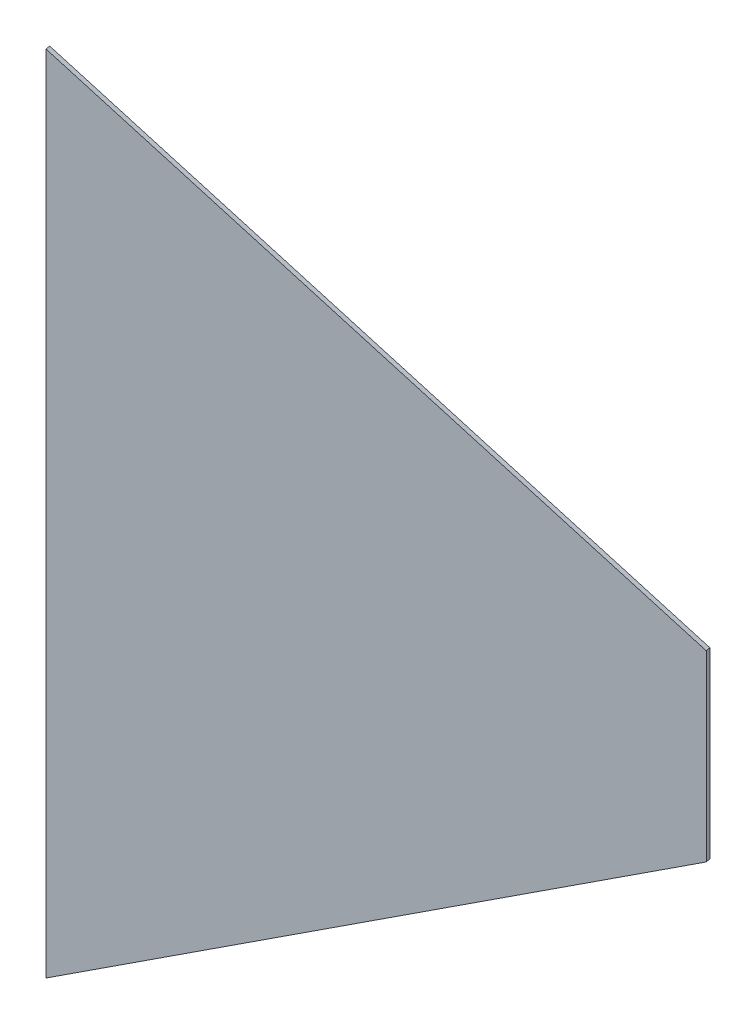
ISO-10303-21;
HEADER;
FILE_DESCRIPTION(('STEP AP214'),'2;1');
FILE_NAME('part.step','',(''),(''),'','','');
FILE_SCHEMA(('AUTOMOTIVE_DESIGN { 1 0 10303 214 1 1 1 1 }'));
ENDSEC;
DATA;
#1=APPLICATION_CONTEXT('core data for automotive mechanical design processes');
#2=APPLICATION_PROTOCOL_DEFINITION('international standard','automotive_design',2000,#1);
#3=PRODUCT_CONTEXT('',#1,'mechanical');
#4=PRODUCT('Part','Part','',(#3));
#5=PRODUCT_RELATED_PRODUCT_CATEGORY('part','',(#4));
#6=PRODUCT_DEFINITION_FORMATION('','',#4);
#7=PRODUCT_DEFINITION_CONTEXT('part definition',#1,'design');
#8=PRODUCT_DEFINITION('design','',#6,#7);
#9=PRODUCT_DEFINITION_SHAPE('','',#8);
#10=(LENGTH_UNIT() NAMED_UNIT(*) SI_UNIT(.MILLI.,.METRE.));
#11=(NAMED_UNIT(*) PLANE_ANGLE_UNIT() SI_UNIT($,.RADIAN.));
#12=(NAMED_UNIT(*) SI_UNIT($,.STERADIAN.) SOLID_ANGLE_UNIT());
#13=UNCERTAINTY_MEASURE_WITH_UNIT(LENGTH_MEASURE(1.E-05),#10,'distance_accuracy_value','');
#14=(GEOMETRIC_REPRESENTATION_CONTEXT(3) GLOBAL_UNCERTAINTY_ASSIGNED_CONTEXT((#13)) GLOBAL_UNIT_ASSIGNED_CONTEXT((#10,
#11,#12)) REPRESENTATION_CONTEXT('',''));
#15=CARTESIAN_POINT('',(0.,0.,0.));
#16=DIRECTION('',(0.,0.,1.));
#17=DIRECTION('',(1.,0.,0.));
#18=AXIS2_PLACEMENT_3D('',#15,#16,#17);
#19=CARTESIAN_POINT('',(187.706,-330.2,720.386581653944));
#20=DIRECTION('',(0.216439613938103,0.,0.976296007119933));
#21=DIRECTION('',(0.,-1.,0.));
#22=AXIS2_PLACEMENT_3D('',#19,#20,#21);
#23=PLANE('',#22);
#24=DIRECTION('',(-0.851290383944916,-0.489578366950732,0.188726534479847));
#25=VECTOR('',#24,1.);
#26=CARTESIAN_POINT('',(281.530559893111,-447.691355947805,699.586177500819));
#27=LINE('',#26,#25);
#28=CARTESIAN_POINT('',(375.412,-393.7,678.773163307889));
#29=VERTEX_POINT('',#28);
#30=CARTESIAN_POINT('',(0.,-609.6,762.));
#31=VERTEX_POINT('',#30);
#32=EDGE_CURVE('E90',#29,#31,#27,.T.);
#33=ORIENTED_EDGE('',*,*,#32,.F.);
#34=DIRECTION('',(0.,1.,0.));
#35=VECTOR('',#34,1.);
#36=CARTESIAN_POINT('',(375.412,-660.4,678.773163307889));
#37=LINE('',#36,#35);
#38=CARTESIAN_POINT('',(375.412,-266.7,678.773163307889));
#39=VERTEX_POINT('',#38);
#40=EDGE_CURVE('E83',#29,#39,#37,.T.);
#41=ORIENTED_EDGE('',*,*,#40,.T.);
#42=DIRECTION('',(-0.851290383944916,0.489578366950732,0.188726534479847));
#43=VECTOR('',#42,1.);
#44=CARTESIAN_POINT('',(281.530559893111,-212.708644052196,699.586177500819));
#45=LINE('',#44,#43);
#46=CARTESIAN_POINT('',(-3.88578058618805E-13,-50.7999999999991,762.));
#47=VERTEX_POINT('',#46);
#48=EDGE_CURVE('E67',#39,#47,#45,.T.);
#49=ORIENTED_EDGE('',*,*,#48,.T.);
#50=DIRECTION('',(0.,1.,0.));
#51=VECTOR('',#50,1.);
#52=CARTESIAN_POINT('',(-3.88578058618805E-13,-660.4,762.));
#53=LINE('',#52,#51);
#54=EDGE_CURVE('E25',#31,#47,#53,.T.);
#55=ORIENTED_EDGE('',*,*,#54,.F.);
#56=EDGE_LOOP('',(#33,#41,#49,#55));
#57=FACE_BOUND('',#56,.T.);
#58=ADVANCED_FACE('F17',(#57),#23,.T.);
#59=CARTESIAN_POINT('',(187.018804225746,-330.2,717.286841831339));
#60=DIRECTION('',(0.216439613938103,0.,0.976296007119933));
#61=DIRECTION('',(0.,-1.,0.));
#62=AXIS2_PLACEMENT_3D('',#59,#60,#61);
#63=PLANE('',#62);
#64=DIRECTION('',(-0.851290383944916,-0.489578366950732,0.188726534479847));
#65=VECTOR('',#64,1.);
#66=CARTESIAN_POINT('',(280.843364118858,-447.691355947805,696.486437678213));
#67=LINE('',#66,#65);
#68=CARTESIAN_POINT('',(374.724804225746,-393.7,675.673423485283));
#69=VERTEX_POINT('',#68);
#70=CARTESIAN_POINT('',(-0.687195774253435,-609.6,758.900260177394));
#71=VERTEX_POINT('',#70);
#72=EDGE_CURVE('E98',#69,#71,#67,.T.);
#73=ORIENTED_EDGE('',*,*,#72,.T.);
#74=DIRECTION('',(0.,1.,0.));
#75=VECTOR('',#74,1.);
#76=CARTESIAN_POINT('',(-0.687195774253865,-660.4,758.900260177394));
#77=LINE('',#76,#75);
#78=CARTESIAN_POINT('',(-0.687195774253865,-50.7999999999991,758.900260177394));
#79=VERTEX_POINT('',#78);
#80=EDGE_CURVE('E11',#71,#79,#77,.T.);
#81=ORIENTED_EDGE('',*,*,#80,.T.);
#82=DIRECTION('',(-0.851290383944916,0.489578366950732,0.188726534479847));
#83=VECTOR('',#82,1.);
#84=CARTESIAN_POINT('',(280.843364118858,-212.708644052196,696.486437678213));
#85=LINE('',#84,#83);
#86=CARTESIAN_POINT('',(374.724804225746,-266.7,675.673423485283));
#87=VERTEX_POINT('',#86);
#88=EDGE_CURVE('E77',#87,#79,#85,.T.);
#89=ORIENTED_EDGE('',*,*,#88,.F.);
#90=DIRECTION('',(0.,1.,0.));
#91=VECTOR('',#90,1.);
#92=CARTESIAN_POINT('',(374.724804225746,-660.4,675.673423485283));
#93=LINE('',#92,#91);
#94=EDGE_CURVE('E85',#69,#87,#93,.T.);
#95=ORIENTED_EDGE('',*,*,#94,.F.);
#96=EDGE_LOOP('',(#73,#81,#89,#95));
#97=FACE_BOUND('',#96,.T.);
#98=ADVANCED_FACE('F141',(#97),#63,.F.);
#99=CARTESIAN_POINT('',(-0.687195774253865,-660.4,758.900260177394));
#100=DIRECTION('',(0.976296007119933,0.,-0.216439613938103));
#101=DIRECTION('',(0.,-1.,0.));
#102=AXIS2_PLACEMENT_3D('',#99,#100,#101);
#103=PLANE('',#102);
#104=ORIENTED_EDGE('',*,*,#54,.T.);
#105=DIRECTION('',(0.216439613938103,0.,0.976296007119933));
#106=VECTOR('',#105,1.);
#107=CARTESIAN_POINT('',(-0.687195774253865,-50.7999999999991,758.900260177394));
#108=LINE('',#107,#106);
#109=EDGE_CURVE('E73',#79,#47,#108,.T.);
#110=ORIENTED_EDGE('',*,*,#109,.F.);
#111=ORIENTED_EDGE('',*,*,#80,.F.);
#112=DIRECTION('',(0.216439613938103,0.,0.976296007119933));
#113=VECTOR('',#112,1.);
#114=CARTESIAN_POINT('',(-0.687195774253435,-609.6,758.900260177394));
#115=LINE('',#114,#113);
#116=EDGE_CURVE('E171',#71,#31,#115,.T.);
#117=ORIENTED_EDGE('',*,*,#116,.T.);
#118=EDGE_LOOP('',(#104,#110,#111,#117));
#119=FACE_BOUND('',#118,.T.);
#120=ADVANCED_FACE('F133',(#119),#103,.F.);
#121=CARTESIAN_POINT('',(280.843364118858,-212.708644052196,696.486437678213));
#122=DIRECTION('',(0.477973404826297,0.871959301007711,-0.105964152735263));
#123=DIRECTION('',(-0.216439613938103,0.,-0.976296007119933));
#124=AXIS2_PLACEMENT_3D('',#121,#122,#123);
#125=PLANE('',#124);
#126=ORIENTED_EDGE('',*,*,#48,.F.);
#127=DIRECTION('',(0.216439613938103,0.,0.976296007119933));
#128=VECTOR('',#127,1.);
#129=CARTESIAN_POINT('',(374.724804225746,-266.7,675.673423485283));
#130=LINE('',#129,#128);
#131=EDGE_CURVE('E71',#87,#39,#130,.T.);
#132=ORIENTED_EDGE('',*,*,#131,.F.);
#133=ORIENTED_EDGE('',*,*,#88,.T.);
#134=ORIENTED_EDGE('',*,*,#109,.T.);
#135=EDGE_LOOP('',(#126,#132,#133,#134));
#136=FACE_BOUND('',#135,.T.);
#137=ADVANCED_FACE('F69',(#136),#125,.T.);
#138=CARTESIAN_POINT('',(374.724804225746,-660.4,675.673423485283));
#139=DIRECTION('',(0.976296007119933,0.,-0.216439613938103));
#140=DIRECTION('',(0.,-1.,0.));
#141=AXIS2_PLACEMENT_3D('',#138,#139,#140);
#142=PLANE('',#141);
#143=ORIENTED_EDGE('',*,*,#40,.F.);
#144=DIRECTION('',(0.216439613938103,0.,0.976296007119933));
#145=VECTOR('',#144,1.);
#146=CARTESIAN_POINT('',(374.724804225746,-393.7,675.673423485283));
#147=LINE('',#146,#145);
#148=EDGE_CURVE('E92',#69,#29,#147,.T.);
#149=ORIENTED_EDGE('',*,*,#148,.F.);
#150=ORIENTED_EDGE('',*,*,#94,.T.);
#151=ORIENTED_EDGE('',*,*,#131,.T.);
#152=EDGE_LOOP('',(#143,#149,#150,#151));
#153=FACE_BOUND('',#152,.T.);
#154=ADVANCED_FACE('F81',(#153),#142,.T.);
#155=CARTESIAN_POINT('',(280.843364118858,-447.691355947805,696.486437678213));
#156=DIRECTION('',(-0.477973404826297,0.87195930100771,0.105964152735263));
#157=DIRECTION('',(0.216439613938103,0.,0.976296007119933));
#158=AXIS2_PLACEMENT_3D('',#155,#156,#157);
#159=PLANE('',#158);
#160=ORIENTED_EDGE('',*,*,#32,.T.);
#161=ORIENTED_EDGE('',*,*,#116,.F.);
#162=ORIENTED_EDGE('',*,*,#72,.F.);
#163=ORIENTED_EDGE('',*,*,#148,.T.);
#164=EDGE_LOOP('',(#160,#161,#162,#163));
#165=FACE_BOUND('',#164,.T.);
#166=ADVANCED_FACE('F112',(#165),#159,.F.);
#167=CLOSED_SHELL('',(#58,#98,#120,#137,#154,#166));
#168=MANIFOLD_SOLID_BREP('B1',#167);
#169=ADVANCED_BREP_SHAPE_REPRESENTATION('',(#18,#168),#14);
#170=SHAPE_DEFINITION_REPRESENTATION(#9,#169);
ENDSEC;
END-ISO-10303-21;
